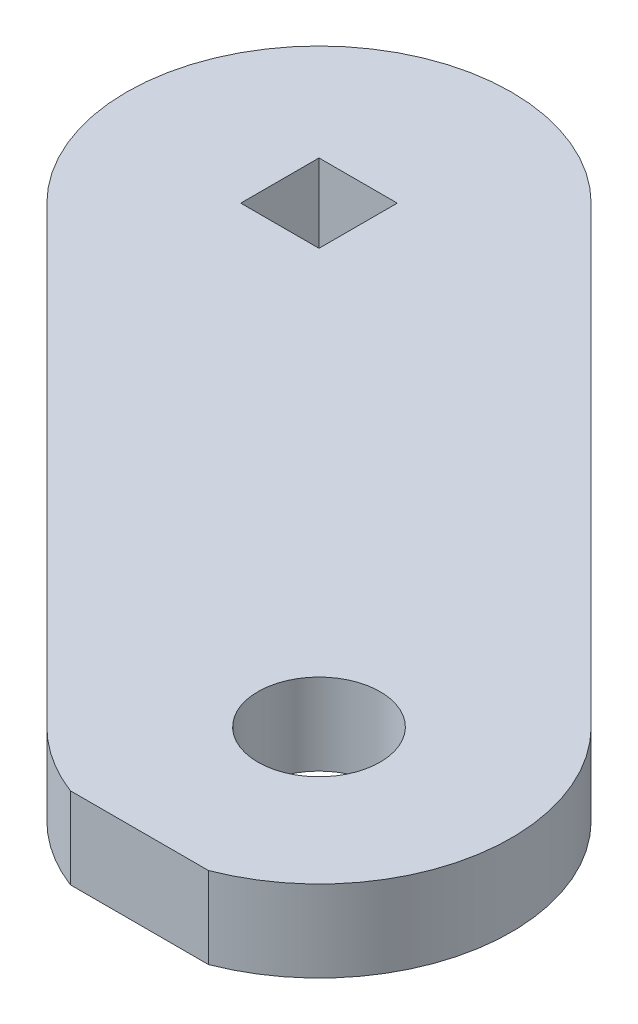
ISO-10303-21;
HEADER;
FILE_DESCRIPTION(('STEP AP214'),'2;1');
FILE_NAME('part.step','',(''),(''),'','','');
FILE_SCHEMA(('AUTOMOTIVE_DESIGN { 1 0 10303 214 1 1 1 1 }'));
ENDSEC;
DATA;
#1=APPLICATION_CONTEXT('core data for automotive mechanical design processes');
#2=APPLICATION_PROTOCOL_DEFINITION('international standard','automotive_design',2000,#1);
#3=PRODUCT_CONTEXT('',#1,'mechanical');
#4=PRODUCT('Part','Part','',(#3));
#5=PRODUCT_RELATED_PRODUCT_CATEGORY('part','',(#4));
#6=PRODUCT_DEFINITION_FORMATION('','',#4);
#7=PRODUCT_DEFINITION_CONTEXT('part definition',#1,'design');
#8=PRODUCT_DEFINITION('design','',#6,#7);
#9=PRODUCT_DEFINITION_SHAPE('','',#8);
#10=(LENGTH_UNIT() NAMED_UNIT(*) SI_UNIT(.MILLI.,.METRE.));
#11=(NAMED_UNIT(*) PLANE_ANGLE_UNIT() SI_UNIT($,.RADIAN.));
#12=(NAMED_UNIT(*) SI_UNIT($,.STERADIAN.) SOLID_ANGLE_UNIT());
#13=UNCERTAINTY_MEASURE_WITH_UNIT(LENGTH_MEASURE(1.E-05),#10,'distance_accuracy_value','');
#14=(GEOMETRIC_REPRESENTATION_CONTEXT(3) GLOBAL_UNCERTAINTY_ASSIGNED_CONTEXT((#13)) GLOBAL_UNIT_ASSIGNED_CONTEXT((#10,
#11,#12)) REPRESENTATION_CONTEXT('',''));
#15=CARTESIAN_POINT('',(0.,0.,0.));
#16=DIRECTION('',(0.,0.,1.));
#17=DIRECTION('',(1.,0.,0.));
#18=AXIS2_PLACEMENT_3D('',#15,#16,#17);
#19=CARTESIAN_POINT('',(0.,-6.35,-3.05));
#20=DIRECTION('',(0.,0.,1.));
#21=DIRECTION('',(1.,0.,0.));
#22=AXIS2_PLACEMENT_3D('',#19,#20,#21);
#23=PLANE('',#22);
#24=DIRECTION('',(1.,0.,0.));
#25=VECTOR('',#24,1.);
#26=CARTESIAN_POINT('',(0.,0.,-3.05));
#27=LINE('',#26,#25);
#28=CARTESIAN_POINT('',(-3.05,0.,-3.05));
#29=VERTEX_POINT('',#28);
#30=CARTESIAN_POINT('',(3.05,0.,-3.05));
#31=VERTEX_POINT('',#30);
#32=EDGE_CURVE('E179',#29,#31,#27,.T.);
#33=ORIENTED_EDGE('',*,*,#32,.F.);
#34=DIRECTION('',(0.,1.,0.));
#35=VECTOR('',#34,1.);
#36=CARTESIAN_POINT('',(-3.05,-6.35,-3.05));
#37=LINE('',#36,#35);
#38=CARTESIAN_POINT('',(-3.05,-6.35,-3.05));
#39=VERTEX_POINT('',#38);
#40=EDGE_CURVE('E11',#39,#29,#37,.T.);
#41=ORIENTED_EDGE('',*,*,#40,.F.);
#42=DIRECTION('',(1.,0.,0.));
#43=VECTOR('',#42,1.);
#44=CARTESIAN_POINT('',(0.,-6.35,-3.05));
#45=LINE('',#44,#43);
#46=CARTESIAN_POINT('',(3.05,-6.35,-3.05));
#47=VERTEX_POINT('',#46);
#48=EDGE_CURVE('E146',#39,#47,#45,.T.);
#49=ORIENTED_EDGE('',*,*,#48,.T.);
#50=DIRECTION('',(0.,1.,0.));
#51=VECTOR('',#50,1.);
#52=CARTESIAN_POINT('',(3.05,-6.35,-3.05));
#53=LINE('',#52,#51);
#54=EDGE_CURVE('E142',#47,#31,#53,.T.);
#55=ORIENTED_EDGE('',*,*,#54,.T.);
#56=EDGE_LOOP('',(#33,#41,#49,#55));
#57=FACE_BOUND('',#56,.T.);
#58=ADVANCED_FACE('F39',(#57),#23,.T.);
#59=CARTESIAN_POINT('',(-3.05,-6.35,0.));
#60=DIRECTION('',(-1.,0.,0.));
#61=DIRECTION('',(0.,0.,1.));
#62=AXIS2_PLACEMENT_3D('',#59,#60,#61);
#63=PLANE('',#62);
#64=DIRECTION('',(0.,0.,1.));
#65=VECTOR('',#64,1.);
#66=CARTESIAN_POINT('',(-3.05,0.,0.));
#67=LINE('',#66,#65);
#68=CARTESIAN_POINT('',(-3.05,0.,3.05));
#69=VERTEX_POINT('',#68);
#70=EDGE_CURVE('E188',#29,#69,#67,.T.);
#71=ORIENTED_EDGE('',*,*,#70,.T.);
#72=DIRECTION('',(0.,1.,0.));
#73=VECTOR('',#72,1.);
#74=CARTESIAN_POINT('',(-3.05,-6.35,3.05));
#75=LINE('',#74,#73);
#76=CARTESIAN_POINT('',(-3.05,-6.35,3.05));
#77=VERTEX_POINT('',#76);
#78=EDGE_CURVE('E50',#77,#69,#75,.T.);
#79=ORIENTED_EDGE('',*,*,#78,.F.);
#80=DIRECTION('',(0.,0.,1.));
#81=VECTOR('',#80,1.);
#82=CARTESIAN_POINT('',(-3.05,-6.35,0.));
#83=LINE('',#82,#81);
#84=EDGE_CURVE('E132',#39,#77,#83,.T.);
#85=ORIENTED_EDGE('',*,*,#84,.F.);
#86=ORIENTED_EDGE('',*,*,#40,.T.);
#87=EDGE_LOOP('',(#71,#79,#85,#86));
#88=FACE_BOUND('',#87,.T.);
#89=ADVANCED_FACE('F234',(#88),#63,.F.);
#90=CARTESIAN_POINT('',(0.,-6.35,3.05));
#91=DIRECTION('',(0.,0.,1.));
#92=DIRECTION('',(1.,0.,0.));
#93=AXIS2_PLACEMENT_3D('',#90,#91,#92);
#94=PLANE('',#93);
#95=DIRECTION('',(1.,0.,0.));
#96=VECTOR('',#95,1.);
#97=CARTESIAN_POINT('',(0.,0.,3.05));
#98=LINE('',#97,#96);
#99=CARTESIAN_POINT('',(3.05,0.,3.05));
#100=VERTEX_POINT('',#99);
#101=EDGE_CURVE('E93',#69,#100,#98,.T.);
#102=ORIENTED_EDGE('',*,*,#101,.T.);
#103=DIRECTION('',(0.,1.,0.));
#104=VECTOR('',#103,1.);
#105=CARTESIAN_POINT('',(3.05,-6.35,3.05));
#106=LINE('',#105,#104);
#107=CARTESIAN_POINT('',(3.05,-6.35,3.05));
#108=VERTEX_POINT('',#107);
#109=EDGE_CURVE('E137',#108,#100,#106,.T.);
#110=ORIENTED_EDGE('',*,*,#109,.F.);
#111=DIRECTION('',(1.,0.,0.));
#112=VECTOR('',#111,1.);
#113=CARTESIAN_POINT('',(0.,-6.35,3.05));
#114=LINE('',#113,#112);
#115=EDGE_CURVE('E126',#77,#108,#114,.T.);
#116=ORIENTED_EDGE('',*,*,#115,.F.);
#117=ORIENTED_EDGE('',*,*,#78,.T.);
#118=EDGE_LOOP('',(#102,#110,#116,#117));
#119=FACE_BOUND('',#118,.T.);
#120=ADVANCED_FACE('F138',(#119),#94,.F.);
#121=CARTESIAN_POINT('',(35.3553390593273,-6.35,35.3553390593274));
#122=DIRECTION('',(0.,1.,0.));
#123=DIRECTION('',(0.,0.,1.));
#124=AXIS2_PLACEMENT_3D('',#121,#122,#123);
#125=CYLINDRICAL_SURFACE('',#124,15.);
#126=CARTESIAN_POINT('',(35.3553390593273,0.,35.3553390593274));
#127=DIRECTION('',(0.,1.,0.));
#128=DIRECTION('',(0.,0.,1.));
#129=AXIS2_PLACEMENT_3D('',#126,#127,#128);
#130=CIRCLE('',#129,15.);
#131=CARTESIAN_POINT('',(29.9701742521928,0.,49.3553390593274));
#132=VERTEX_POINT('',#131);
#133=CARTESIAN_POINT('',(24.7487373415291,0.,45.9619407771256));
#134=VERTEX_POINT('',#133);
#135=EDGE_CURVE('E155',#132,#134,#130,.F.);
#136=ORIENTED_EDGE('',*,*,#135,.T.);
#137=DIRECTION('',(0.,1.,0.));
#138=VECTOR('',#137,1.);
#139=CARTESIAN_POINT('',(24.7487373415291,-6.35,45.9619407771256));
#140=LINE('',#139,#138);
#141=CARTESIAN_POINT('',(24.7487373415291,-6.35,45.9619407771256));
#142=VERTEX_POINT('',#141);
#143=EDGE_CURVE('E196',#142,#134,#140,.T.);
#144=ORIENTED_EDGE('',*,*,#143,.F.);
#145=CARTESIAN_POINT('',(35.3553390593273,-6.35,35.3553390593274));
#146=DIRECTION('',(0.,1.,0.));
#147=DIRECTION('',(0.,0.,1.));
#148=AXIS2_PLACEMENT_3D('',#145,#146,#147);
#149=CIRCLE('',#148,15.);
#150=CARTESIAN_POINT('',(29.9701742521928,-6.35,49.3553390593274));
#151=VERTEX_POINT('',#150);
#152=EDGE_CURVE('E190',#151,#142,#149,.F.);
#153=ORIENTED_EDGE('',*,*,#152,.F.);
#154=DIRECTION('',(0.,1.,0.));
#155=VECTOR('',#154,1.);
#156=CARTESIAN_POINT('',(29.9701742521928,-6.35,49.3553390593274));
#157=LINE('',#156,#155);
#158=EDGE_CURVE('E43',#151,#132,#157,.T.);
#159=ORIENTED_EDGE('',*,*,#158,.T.);
#160=EDGE_LOOP('',(#136,#144,#153,#159));
#161=FACE_BOUND('',#160,.T.);
#162=ADVANCED_FACE('F215',(#161),#125,.T.);
#163=CARTESIAN_POINT('',(-10.6066017177982,-6.35,10.6066017177982));
#164=DIRECTION('',(-0.707106781186548,0.,0.707106781186546));
#165=DIRECTION('',(0.707106781186547,0.,0.707106781186549));
#166=AXIS2_PLACEMENT_3D('',#163,#164,#165);
#167=PLANE('',#166);
#168=DIRECTION('',(0.707106781186546,0.,0.707106781186549));
#169=VECTOR('',#168,1.);
#170=CARTESIAN_POINT('',(-10.6066017177982,0.,10.6066017177982));
#171=LINE('',#170,#169);
#172=CARTESIAN_POINT('',(-10.6066017177982,0.,10.6066017177982));
#173=VERTEX_POINT('',#172);
#174=EDGE_CURVE('E171',#173,#134,#171,.T.);
#175=ORIENTED_EDGE('',*,*,#174,.F.);
#176=DIRECTION('',(0.,1.,0.));
#177=VECTOR('',#176,1.);
#178=CARTESIAN_POINT('',(-10.6066017177982,-6.35,10.6066017177982));
#179=LINE('',#178,#177);
#180=CARTESIAN_POINT('',(-10.6066017177982,-6.35,10.6066017177982));
#181=VERTEX_POINT('',#180);
#182=EDGE_CURVE('E199',#181,#173,#179,.T.);
#183=ORIENTED_EDGE('',*,*,#182,.F.);
#184=DIRECTION('',(0.707106781186546,0.,0.707106781186549));
#185=VECTOR('',#184,1.);
#186=CARTESIAN_POINT('',(-10.6066017177982,-6.35,10.6066017177982));
#187=LINE('',#186,#185);
#188=EDGE_CURVE('E275',#181,#142,#187,.T.);
#189=ORIENTED_EDGE('',*,*,#188,.T.);
#190=ORIENTED_EDGE('',*,*,#143,.T.);
#191=EDGE_LOOP('',(#175,#183,#189,#190));
#192=FACE_BOUND('',#191,.T.);
#193=ADVANCED_FACE('F242',(#192),#167,.T.);
#194=CARTESIAN_POINT('',(0.,-6.35,0.));
#195=DIRECTION('',(0.,1.,0.));
#196=DIRECTION('',(0.,0.,1.));
#197=AXIS2_PLACEMENT_3D('',#194,#195,#196);
#198=CYLINDRICAL_SURFACE('',#197,15.);
#199=CARTESIAN_POINT('',(0.,0.,0.));
#200=DIRECTION('',(0.,1.,0.));
#201=DIRECTION('',(0.,0.,1.));
#202=AXIS2_PLACEMENT_3D('',#199,#200,#201);
#203=CIRCLE('',#202,15.);
#204=CARTESIAN_POINT('',(10.6066017177982,0.,-10.6066017177982));
#205=VERTEX_POINT('',#204);
#206=EDGE_CURVE('E167',#205,#173,#203,.T.);
#207=ORIENTED_EDGE('',*,*,#206,.F.);
#208=DIRECTION('',(0.,1.,0.));
#209=VECTOR('',#208,1.);
#210=CARTESIAN_POINT('',(10.6066017177982,-6.35,-10.6066017177982));
#211=LINE('',#210,#209);
#212=CARTESIAN_POINT('',(10.6066017177982,-6.35,-10.6066017177982));
#213=VERTEX_POINT('',#212);
#214=EDGE_CURVE('E202',#213,#205,#211,.T.);
#215=ORIENTED_EDGE('',*,*,#214,.F.);
#216=CARTESIAN_POINT('',(0.,-6.35,0.));
#217=DIRECTION('',(0.,1.,0.));
#218=DIRECTION('',(0.,0.,1.));
#219=AXIS2_PLACEMENT_3D('',#216,#217,#218);
#220=CIRCLE('',#219,15.);
#221=EDGE_CURVE('E278',#213,#181,#220,.T.);
#222=ORIENTED_EDGE('',*,*,#221,.T.);
#223=ORIENTED_EDGE('',*,*,#182,.T.);
#224=EDGE_LOOP('',(#207,#215,#222,#223));
#225=FACE_BOUND('',#224,.T.);
#226=ADVANCED_FACE('F245',(#225),#198,.T.);
#227=CARTESIAN_POINT('',(10.6066017177982,-6.35,-10.6066017177982));
#228=DIRECTION('',(-0.707106781186549,0.,0.707106781186546));
#229=DIRECTION('',(0.707106781186546,0.,0.707106781186549));
#230=AXIS2_PLACEMENT_3D('',#227,#228,#229);
#231=PLANE('',#230);
#232=DIRECTION('',(0.707106781186546,0.,0.707106781186549));
#233=VECTOR('',#232,1.);
#234=CARTESIAN_POINT('',(10.6066017177982,0.,-10.6066017177982));
#235=LINE('',#234,#233);
#236=CARTESIAN_POINT('',(45.9619407771255,0.,24.7487373415292));
#237=VERTEX_POINT('',#236);
#238=EDGE_CURVE('E164',#205,#237,#235,.T.);
#239=ORIENTED_EDGE('',*,*,#238,.T.);
#240=DIRECTION('',(0.,1.,0.));
#241=VECTOR('',#240,1.);
#242=CARTESIAN_POINT('',(45.9619407771255,-6.35,24.7487373415292));
#243=LINE('',#242,#241);
#244=CARTESIAN_POINT('',(45.9619407771255,-6.35,24.7487373415292));
#245=VERTEX_POINT('',#244);
#246=EDGE_CURVE('E205',#245,#237,#243,.T.);
#247=ORIENTED_EDGE('',*,*,#246,.F.);
#248=DIRECTION('',(0.707106781186546,0.,0.707106781186549));
#249=VECTOR('',#248,1.);
#250=CARTESIAN_POINT('',(10.6066017177982,-6.35,-10.6066017177982));
#251=LINE('',#250,#249);
#252=EDGE_CURVE('E284',#213,#245,#251,.T.);
#253=ORIENTED_EDGE('',*,*,#252,.F.);
#254=ORIENTED_EDGE('',*,*,#214,.T.);
#255=EDGE_LOOP('',(#239,#247,#253,#254));
#256=FACE_BOUND('',#255,.T.);
#257=ADVANCED_FACE('F249',(#256),#231,.F.);
#258=CARTESIAN_POINT('',(40.7405038664618,0.,49.3553390593274));
#259=VERTEX_POINT('',#258);
#260=EDGE_CURVE('E160',#237,#259,#130,.F.);
#261=ORIENTED_EDGE('',*,*,#260,.T.);
#262=DIRECTION('',(0.,1.,0.));
#263=VECTOR('',#262,1.);
#264=CARTESIAN_POINT('',(40.7405038664618,-6.35,49.3553390593274));
#265=LINE('',#264,#263);
#266=CARTESIAN_POINT('',(40.7405038664618,-6.35,49.3553390593274));
#267=VERTEX_POINT('',#266);
#268=EDGE_CURVE('E208',#267,#259,#265,.T.);
#269=ORIENTED_EDGE('',*,*,#268,.F.);
#270=EDGE_CURVE('E287',#245,#267,#149,.F.);
#271=ORIENTED_EDGE('',*,*,#270,.F.);
#272=ORIENTED_EDGE('',*,*,#246,.T.);
#273=EDGE_LOOP('',(#261,#269,#271,#272));
#274=FACE_BOUND('',#273,.T.);
#275=ADVANCED_FACE('F230',(#274),#125,.T.);
#276=CARTESIAN_POINT('',(35.3553390593273,-6.35,35.3553390593274));
#277=DIRECTION('',(0.,1.,0.));
#278=DIRECTION('',(0.,0.,1.));
#279=AXIS2_PLACEMENT_3D('',#276,#277,#278);
#280=CYLINDRICAL_SURFACE('',#279,4.7625);
#281=CARTESIAN_POINT('',(35.3553390593273,-6.35,35.3553390593274));
#282=DIRECTION('',(0.,1.,0.));
#283=DIRECTION('',(0.,0.,1.));
#284=AXIS2_PLACEMENT_3D('',#281,#282,#283);
#285=CIRCLE('',#284,4.7625);
#286=CARTESIAN_POINT('',(35.3553390593273,-6.35,40.1178390593274));
#287=VERTEX_POINT('',#286);
#288=EDGE_CURVE('E149',#287,#287,#285,.T.);
#289=ORIENTED_EDGE('',*,*,#288,.F.);
#290=EDGE_LOOP('',(#289));
#291=FACE_BOUND('',#290,.T.);
#292=CARTESIAN_POINT('',(35.3553390593273,0.,35.3553390593274));
#293=DIRECTION('',(0.,1.,0.));
#294=DIRECTION('',(0.,0.,1.));
#295=AXIS2_PLACEMENT_3D('',#292,#293,#294);
#296=CIRCLE('',#295,4.7625);
#297=CARTESIAN_POINT('',(35.3553390593273,0.,40.1178390593274));
#298=VERTEX_POINT('',#297);
#299=EDGE_CURVE('E175',#298,#298,#296,.T.);
#300=ORIENTED_EDGE('',*,*,#299,.T.);
#301=EDGE_LOOP('',(#300));
#302=FACE_BOUND('',#301,.T.);
#303=ADVANCED_FACE('F224',(#291,#302),#280,.F.);
#304=CARTESIAN_POINT('',(0.,-6.35,49.3553390593274));
#305=DIRECTION('',(0.,0.,1.));
#306=DIRECTION('',(1.,0.,0.));
#307=AXIS2_PLACEMENT_3D('',#304,#305,#306);
#308=PLANE('',#307);
#309=DIRECTION('',(1.,0.,0.));
#310=VECTOR('',#309,1.);
#311=CARTESIAN_POINT('',(0.,0.,49.3553390593274));
#312=LINE('',#311,#310);
#313=EDGE_CURVE('E159',#132,#259,#312,.T.);
#314=ORIENTED_EDGE('',*,*,#313,.F.);
#315=ORIENTED_EDGE('',*,*,#158,.F.);
#316=DIRECTION('',(1.,0.,0.));
#317=VECTOR('',#316,1.);
#318=CARTESIAN_POINT('',(0.,-6.35,49.3553390593274));
#319=LINE('',#318,#317);
#320=EDGE_CURVE('E288',#151,#267,#319,.T.);
#321=ORIENTED_EDGE('',*,*,#320,.T.);
#322=ORIENTED_EDGE('',*,*,#268,.T.);
#323=EDGE_LOOP('',(#314,#315,#321,#322));
#324=FACE_BOUND('',#323,.T.);
#325=ADVANCED_FACE('F41',(#324),#308,.T.);
#326=CARTESIAN_POINT('',(3.05,-6.35,0.));
#327=DIRECTION('',(-1.,0.,0.));
#328=DIRECTION('',(0.,0.,1.));
#329=AXIS2_PLACEMENT_3D('',#326,#327,#328);
#330=PLANE('',#329);
#331=DIRECTION('',(0.,0.,1.));
#332=VECTOR('',#331,1.);
#333=CARTESIAN_POINT('',(3.05,0.,0.));
#334=LINE('',#333,#332);
#335=EDGE_CURVE('E183',#31,#100,#334,.T.);
#336=ORIENTED_EDGE('',*,*,#335,.F.);
#337=ORIENTED_EDGE('',*,*,#54,.F.);
#338=DIRECTION('',(0.,0.,1.));
#339=VECTOR('',#338,1.);
#340=CARTESIAN_POINT('',(3.05,-6.35,0.));
#341=LINE('',#340,#339);
#342=EDGE_CURVE('E131',#47,#108,#341,.T.);
#343=ORIENTED_EDGE('',*,*,#342,.T.);
#344=ORIENTED_EDGE('',*,*,#109,.T.);
#345=EDGE_LOOP('',(#336,#337,#343,#344));
#346=FACE_BOUND('',#345,.T.);
#347=ADVANCED_FACE('F144',(#346),#330,.T.);
#348=CARTESIAN_POINT('',(0.,-6.35,0.));
#349=DIRECTION('',(0.,1.,0.));
#350=DIRECTION('',(0.,0.,1.));
#351=AXIS2_PLACEMENT_3D('',#348,#349,#350);
#352=PLANE('',#351);
#353=ORIENTED_EDGE('',*,*,#152,.T.);
#354=ORIENTED_EDGE('',*,*,#188,.F.);
#355=ORIENTED_EDGE('',*,*,#221,.F.);
#356=ORIENTED_EDGE('',*,*,#252,.T.);
#357=ORIENTED_EDGE('',*,*,#270,.T.);
#358=ORIENTED_EDGE('',*,*,#320,.F.);
#359=EDGE_LOOP('',(#353,#354,#355,#356,#357,#358));
#360=FACE_BOUND('',#359,.T.);
#361=ORIENTED_EDGE('',*,*,#288,.T.);
#362=EDGE_LOOP('',(#361));
#363=FACE_BOUND('',#362,.T.);
#364=ORIENTED_EDGE('',*,*,#48,.F.);
#365=ORIENTED_EDGE('',*,*,#84,.T.);
#366=ORIENTED_EDGE('',*,*,#115,.T.);
#367=ORIENTED_EDGE('',*,*,#342,.F.);
#368=EDGE_LOOP('',(#364,#365,#366,#367));
#369=FACE_BOUND('',#368,.T.);
#370=ADVANCED_FACE('F129',(#360,#363,#369),#352,.F.);
#371=CARTESIAN_POINT('',(0.,0.,0.));
#372=DIRECTION('',(0.,1.,0.));
#373=DIRECTION('',(0.,0.,1.));
#374=AXIS2_PLACEMENT_3D('',#371,#372,#373);
#375=PLANE('',#374);
#376=ORIENTED_EDGE('',*,*,#135,.F.);
#377=ORIENTED_EDGE('',*,*,#313,.T.);
#378=ORIENTED_EDGE('',*,*,#260,.F.);
#379=ORIENTED_EDGE('',*,*,#238,.F.);
#380=ORIENTED_EDGE('',*,*,#206,.T.);
#381=ORIENTED_EDGE('',*,*,#174,.T.);
#382=EDGE_LOOP('',(#376,#377,#378,#379,#380,#381));
#383=FACE_BOUND('',#382,.T.);
#384=ORIENTED_EDGE('',*,*,#299,.F.);
#385=EDGE_LOOP('',(#384));
#386=FACE_BOUND('',#385,.T.);
#387=ORIENTED_EDGE('',*,*,#32,.T.);
#388=ORIENTED_EDGE('',*,*,#335,.T.);
#389=ORIENTED_EDGE('',*,*,#101,.F.);
#390=ORIENTED_EDGE('',*,*,#70,.F.);
#391=EDGE_LOOP('',(#387,#388,#389,#390));
#392=FACE_BOUND('',#391,.T.);
#393=ADVANCED_FACE('F219',(#383,#386,#392),#375,.T.);
#394=CLOSED_SHELL('',(#58,#89,#120,#162,#193,#226,#257,#275,#303,#325,#347,#370,#393));
#395=MANIFOLD_SOLID_BREP('B2',#394);
#396=ADVANCED_BREP_SHAPE_REPRESENTATION('',(#18,#395),#14);
#397=SHAPE_DEFINITION_REPRESENTATION(#9,#396);
ENDSEC;
END-ISO-10303-21;
